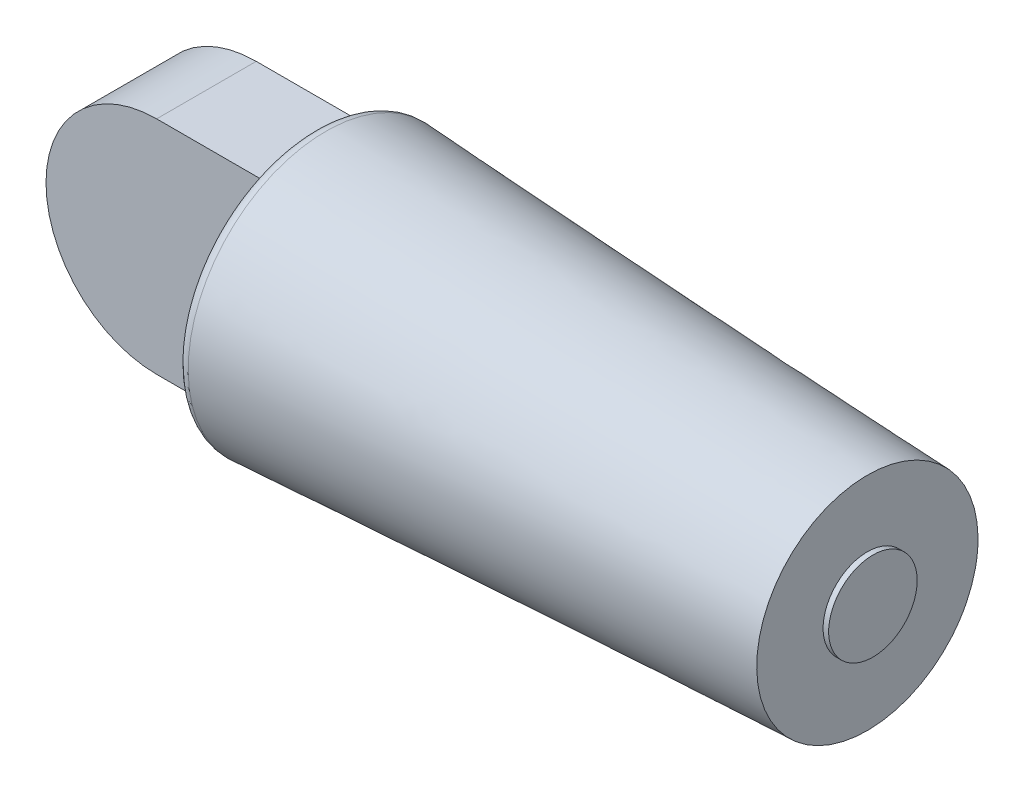
ISO-10303-21;
HEADER;
FILE_DESCRIPTION(('STEP AP214'),'2;1');
FILE_NAME('part.step','',(''),(''),'','','');
FILE_SCHEMA(('AUTOMOTIVE_DESIGN { 1 0 10303 214 1 1 1 1 }'));
ENDSEC;
DATA;
#1=APPLICATION_CONTEXT('core data for automotive mechanical design processes');
#2=APPLICATION_PROTOCOL_DEFINITION('international standard','automotive_design',2000,#1);
#3=PRODUCT_CONTEXT('',#1,'mechanical');
#4=PRODUCT('Part','Part','',(#3));
#5=PRODUCT_RELATED_PRODUCT_CATEGORY('part','',(#4));
#6=PRODUCT_DEFINITION_FORMATION('','',#4);
#7=PRODUCT_DEFINITION_CONTEXT('part definition',#1,'design');
#8=PRODUCT_DEFINITION('design','',#6,#7);
#9=PRODUCT_DEFINITION_SHAPE('','',#8);
#10=(LENGTH_UNIT() NAMED_UNIT(*) SI_UNIT(.MILLI.,.METRE.));
#11=(NAMED_UNIT(*) PLANE_ANGLE_UNIT() SI_UNIT($,.RADIAN.));
#12=(NAMED_UNIT(*) SI_UNIT($,.STERADIAN.) SOLID_ANGLE_UNIT());
#13=UNCERTAINTY_MEASURE_WITH_UNIT(LENGTH_MEASURE(1.E-05),#10,'distance_accuracy_value','');
#14=(GEOMETRIC_REPRESENTATION_CONTEXT(3) GLOBAL_UNCERTAINTY_ASSIGNED_CONTEXT((#13)) GLOBAL_UNIT_ASSIGNED_CONTEXT((#10,
#11,#12)) REPRESENTATION_CONTEXT('',''));
#15=CARTESIAN_POINT('',(0.,0.,0.));
#16=DIRECTION('',(0.,0.,1.));
#17=DIRECTION('',(1.,0.,0.));
#18=AXIS2_PLACEMENT_3D('',#15,#16,#17);
#19=CARTESIAN_POINT('',(10.,0.,0.));
#20=DIRECTION('',(1.,0.,0.));
#21=DIRECTION('',(0.,0.,-1.));
#22=AXIS2_PLACEMENT_3D('',#19,#20,#21);
#23=TOROIDAL_SURFACE('',#22,114.414427293307,10.);
#24=CARTESIAN_POINT('',(0.,0.,0.));
#25=DIRECTION('',(1.,0.,0.));
#26=DIRECTION('',(0.,0.,-1.));
#27=AXIS2_PLACEMENT_3D('',#24,#25,#26);
#28=CIRCLE('',#27,114.414427293307);
#29=CARTESIAN_POINT('',(0.,0.,-114.414427293307));
#30=VERTEX_POINT('',#29);
#31=EDGE_CURVE('E102',#30,#30,#28,.F.);
#32=ORIENTED_EDGE('',*,*,#31,.F.);
#33=EDGE_LOOP('',(#32));
#34=FACE_BOUND('',#33,.T.);
#35=CARTESIAN_POINT('',(10.5672782153275,0.,0.));
#36=DIRECTION('',(1.,0.,0.));
#37=DIRECTION('',(0.,0.,-1.));
#38=AXIS2_PLACEMENT_3D('',#35,#36,#37);
#39=CIRCLE('',#38,124.398324098984);
#40=CARTESIAN_POINT('',(10.5672782153275,10.081074166,123.989172843017));
#41=VERTEX_POINT('',#40);
#42=EDGE_CURVE('E44',#41,#41,#39,.T.);
#43=ORIENTED_EDGE('',*,*,#42,.F.);
#44=EDGE_LOOP('',(#43));
#45=FACE_BOUND('',#44,.T.);
#46=ADVANCED_FACE('F41',(#34,#45),#23,.T.);
#47=CARTESIAN_POINT('',(-200.,100.,-47.6787688835192));
#48=DIRECTION('',(0.,0.,1.));
#49=DIRECTION('',(0.,-1.,0.));
#50=AXIS2_PLACEMENT_3D('',#47,#48,#49);
#51=PLANE('',#50);
#52=DIRECTION('',(1.,0.,0.));
#53=VECTOR('',#52,1.);
#54=CARTESIAN_POINT('',(-200.,-100.,-47.6787688835192));
#55=LINE('',#54,#53);
#56=CARTESIAN_POINT('',(-100.,-100.,-47.6787688835192));
#57=VERTEX_POINT('',#56);
#58=CARTESIAN_POINT('',(0.,-100.,-47.6787688835192));
#59=VERTEX_POINT('',#58);
#60=EDGE_CURVE('E93',#57,#59,#55,.T.);
#61=ORIENTED_EDGE('',*,*,#60,.F.);
#62=CARTESIAN_POINT('',(-100.,0.,-47.6787688835192));
#63=DIRECTION('',(0.,0.,1.));
#64=DIRECTION('',(0.,-1.,0.));
#65=AXIS2_PLACEMENT_3D('',#62,#63,#64);
#66=CIRCLE('',#65,100.);
#67=CARTESIAN_POINT('',(-100.,100.,-47.6787688835192));
#68=VERTEX_POINT('',#67);
#69=EDGE_CURVE('E81',#68,#57,#66,.T.);
#70=ORIENTED_EDGE('',*,*,#69,.F.);
#71=DIRECTION('',(1.,0.,0.));
#72=VECTOR('',#71,1.);
#73=CARTESIAN_POINT('',(-200.,100.,-47.6787688835192));
#74=LINE('',#73,#72);
#75=CARTESIAN_POINT('',(0.,100.,-47.6787688835192));
#76=VERTEX_POINT('',#75);
#77=EDGE_CURVE('E64',#68,#76,#74,.T.);
#78=ORIENTED_EDGE('',*,*,#77,.T.);
#79=DIRECTION('',(0.,-1.,0.));
#80=VECTOR('',#79,1.);
#81=CARTESIAN_POINT('',(0.,100.,-47.6787688835192));
#82=LINE('',#81,#80);
#83=EDGE_CURVE('E98',#76,#59,#82,.T.);
#84=ORIENTED_EDGE('',*,*,#83,.T.);
#85=EDGE_LOOP('',(#61,#70,#78,#84));
#86=FACE_BOUND('',#85,.T.);
#87=ADVANCED_FACE('F97',(#86),#51,.F.);
#88=CARTESIAN_POINT('',(-200.,100.,42.3212311164808));
#89=DIRECTION('',(0.,0.,-1.));
#90=DIRECTION('',(0.,1.,0.));
#91=AXIS2_PLACEMENT_3D('',#88,#89,#90);
#92=PLANE('',#91);
#93=DIRECTION('',(1.,0.,0.));
#94=VECTOR('',#93,1.);
#95=CARTESIAN_POINT('',(-200.,100.,42.3212311164808));
#96=LINE('',#95,#94);
#97=CARTESIAN_POINT('',(-100.,100.,42.3212311164808));
#98=VERTEX_POINT('',#97);
#99=CARTESIAN_POINT('',(0.,100.,42.3212311164808));
#100=VERTEX_POINT('',#99);
#101=EDGE_CURVE('E104',#98,#100,#96,.T.);
#102=ORIENTED_EDGE('',*,*,#101,.F.);
#103=CARTESIAN_POINT('',(-100.,0.,42.3212311164808));
#104=DIRECTION('',(0.,0.,-1.));
#105=DIRECTION('',(0.,1.,0.));
#106=AXIS2_PLACEMENT_3D('',#103,#104,#105);
#107=CIRCLE('',#106,100.);
#108=CARTESIAN_POINT('',(-100.,-100.,42.3212311164808));
#109=VERTEX_POINT('',#108);
#110=EDGE_CURVE('E56',#98,#109,#107,.F.);
#111=ORIENTED_EDGE('',*,*,#110,.T.);
#112=DIRECTION('',(1.,0.,0.));
#113=VECTOR('',#112,1.);
#114=CARTESIAN_POINT('',(-200.,-100.,42.3212311164808));
#115=LINE('',#114,#113);
#116=CARTESIAN_POINT('',(0.,-100.,42.3212311164808));
#117=VERTEX_POINT('',#116);
#118=EDGE_CURVE('E95',#109,#117,#115,.T.);
#119=ORIENTED_EDGE('',*,*,#118,.T.);
#120=DIRECTION('',(0.,1.,0.));
#121=VECTOR('',#120,1.);
#122=CARTESIAN_POINT('',(0.,100.,42.3212311164808));
#123=LINE('',#122,#121);
#124=EDGE_CURVE('E192',#117,#100,#123,.T.);
#125=ORIENTED_EDGE('',*,*,#124,.T.);
#126=EDGE_LOOP('',(#102,#111,#119,#125));
#127=FACE_BOUND('',#126,.T.);
#128=ADVANCED_FACE('F159',(#127),#92,.F.);
#129=CARTESIAN_POINT('',(0.,0.,0.));
#130=DIRECTION('',(1.,0.,0.));
#131=DIRECTION('',(0.,0.,-1.));
#132=AXIS2_PLACEMENT_3D('',#129,#130,#131);
#133=PLANE('',#132);
#134=ORIENTED_EDGE('',*,*,#31,.T.);
#135=EDGE_LOOP('',(#134));
#136=FACE_BOUND('',#135,.T.);
#137=ORIENTED_EDGE('',*,*,#83,.F.);
#138=DIRECTION('',(0.,0.,-1.));
#139=VECTOR('',#138,1.);
#140=CARTESIAN_POINT('',(0.,100.,-47.6787688835192));
#141=LINE('',#140,#139);
#142=EDGE_CURVE('E195',#100,#76,#141,.T.);
#143=ORIENTED_EDGE('',*,*,#142,.F.);
#144=ORIENTED_EDGE('',*,*,#124,.F.);
#145=DIRECTION('',(0.,0.,1.));
#146=VECTOR('',#145,1.);
#147=CARTESIAN_POINT('',(0.,-100.,-47.6787688835192));
#148=LINE('',#147,#146);
#149=EDGE_CURVE('E190',#59,#117,#148,.T.);
#150=ORIENTED_EDGE('',*,*,#149,.F.);
#151=EDGE_LOOP('',(#137,#143,#144,#150));
#152=FACE_BOUND('',#151,.T.);
#153=ADVANCED_FACE('F129',(#136,#152),#133,.F.);
#154=CARTESIAN_POINT('',(500.,0.,0.));
#155=DIRECTION('',(1.,0.,0.));
#156=DIRECTION('',(0.,0.,-1.));
#157=AXIS2_PLACEMENT_3D('',#154,#155,#156);
#158=PLANE('',#157);
#159=CARTESIAN_POINT('',(500.,0.,0.));
#160=DIRECTION('',(1.,0.,0.));
#161=DIRECTION('',(0.,0.,-1.));
#162=AXIS2_PLACEMENT_3D('',#159,#160,#161);
#163=CIRCLE('',#162,40.);
#164=CARTESIAN_POINT('',(500.,0.,-40.));
#165=VERTEX_POINT('',#164);
#166=EDGE_CURVE('E12',#165,#165,#163,.T.);
#167=ORIENTED_EDGE('',*,*,#166,.F.);
#168=EDGE_LOOP('',(#167));
#169=FACE_BOUND('',#168,.T.);
#170=CARTESIAN_POINT('',(500.,0.,0.));
#171=DIRECTION('',(1.,0.,0.));
#172=DIRECTION('',(0.,0.,-1.));
#173=AXIS2_PLACEMENT_3D('',#170,#171,#172);
#174=CIRCLE('',#173,100.);
#175=CARTESIAN_POINT('',(500.,33.6372161619015,94.1729137750209));
#176=VERTEX_POINT('',#175);
#177=EDGE_CURVE('E99',#176,#176,#174,.T.);
#178=ORIENTED_EDGE('',*,*,#177,.T.);
#179=EDGE_LOOP('',(#178));
#180=FACE_BOUND('',#179,.T.);
#181=ADVANCED_FACE('F127',(#169,#180),#158,.T.);
#182=CARTESIAN_POINT('',(0.,9.57247656908665,124.632931813122));
#183=CARTESIAN_POINT('',(500.,33.6372161619015,94.1729137750209));
#184=CARTESIAN_POINT('',(0.,-239.693387057157,143.777884951295));
#185=CARTESIAN_POINT('',(500.,-154.70861138814,161.447346098824));
#186=CARTESIAN_POINT('',(0.,-258.83834019533,-105.487978674948));
#187=CARTESIAN_POINT('',(500.,-221.983043711943,-26.898481451218));
#188=CARTESIAN_POINT('',(0.,-9.57247656908678,-124.632931813122));
#189=CARTESIAN_POINT('',(500.,-33.6372161619014,-94.1729137750209));
#190=CARTESIAN_POINT('',(0.,239.693387057157,-143.777884951295));
#191=CARTESIAN_POINT('',(500.,154.70861138814,-161.447346098824));
#192=CARTESIAN_POINT('',(0.,258.83834019533,105.487978674948));
#193=CARTESIAN_POINT('',(500.,221.983043711943,26.8984814512181));
#194=CARTESIAN_POINT('',(0.,9.57247656908665,124.632931813122));
#195=CARTESIAN_POINT('',(500.,33.6372161619015,94.1729137750209));
#196=(BOUNDED_SURFACE() B_SPLINE_SURFACE(3,1,((#182,#183),(#184,#185),(#186,#187),(#188,#189),
(#190,#191),(#192,#193),(#194,#195)),.UNSPECIFIED.,.T.,.F.,.F.) B_SPLINE_SURFACE_WITH_KNOTS((4,
3,4),(2,2),(0.,0.5,1.),(0.,1.),
.UNSPECIFIED.) GEOMETRIC_REPRESENTATION_ITEM() RATIONAL_B_SPLINE_SURFACE(((1.,1.),
(0.333333333333334,0.333333333333333),(0.333333333333334,0.333333333333333),(1.,1.),
(0.333333333333333,0.333333333333333),(0.333333333333333,0.333333333333333),(1.,1.))) REPRESENTATION_ITEM('') SURFACE());
#197=CARTESIAN_POINT('',(10.5672782153275,10.081074166,123.989172843017));
#198=CARTESIAN_POINT('',(15.6655357339178,10.326450645124,123.678586811059));
#199=CARTESIAN_POINT('',(20.7637932525081,10.571827124248,123.3680007791));
#200=CARTESIAN_POINT('',(30.9603082896888,11.0625800824959,122.746828715184));
#201=CARTESIAN_POINT('',(36.0585658082792,11.3079565616199,122.436242683225));
#202=CARTESIAN_POINT('',(46.2550808454598,11.7987095198678,121.815070619309));
#203=CARTESIAN_POINT('',(51.3533383640502,12.0440859989918,121.504484587351));
#204=CARTESIAN_POINT('',(61.5498534012309,12.5348389572397,120.883312523434));
#205=CARTESIAN_POINT('',(66.6481109198212,12.7802154363637,120.572726491476));
#206=CARTESIAN_POINT('',(76.8446259570019,13.2709683946117,119.951554427559));
#207=CARTESIAN_POINT('',(81.9428834755922,13.5163448737356,119.640968395601));
#208=CARTESIAN_POINT('',(92.1393985127729,14.0070978319836,119.019796331684));
#209=CARTESIAN_POINT('',(97.2376560313632,14.2524743111076,118.709210299726));
#210=CARTESIAN_POINT('',(107.434171068544,14.7432272693555,118.088038235809));
#211=CARTESIAN_POINT('',(112.532428587134,14.9886037484795,117.777452203851));
#212=CARTESIAN_POINT('',(122.728943624315,15.4793567067274,117.156280139934));
#213=CARTESIAN_POINT('',(127.827201142905,15.7247331858514,116.845694107976));
#214=CARTESIAN_POINT('',(138.023716180086,16.2154861440993,116.22452204406));
#215=CARTESIAN_POINT('',(143.121973698676,16.4608626232233,115.913936012101));
#216=CARTESIAN_POINT('',(153.318488735857,16.9516155814713,115.292763948185));
#217=CARTESIAN_POINT('',(158.416746254447,17.1969920605952,114.982177916226));
#218=CARTESIAN_POINT('',(168.613261291628,17.6877450188432,114.36100585231));
#219=CARTESIAN_POINT('',(173.711518810218,17.9331214979672,114.050419820352));
#220=CARTESIAN_POINT('',(183.908033847399,18.4238744562151,113.429247756435));
#221=CARTESIAN_POINT('',(189.006291365989,18.6692509353391,113.118661724477));
#222=CARTESIAN_POINT('',(199.20280640317,19.160003893587,112.49748966056));
#223=CARTESIAN_POINT('',(204.30106392176,19.405380372711,112.186903628602));
#224=CARTESIAN_POINT('',(214.497578958941,19.8961333309589,111.565731564685));
#225=CARTESIAN_POINT('',(219.595836477531,20.1415098100829,111.255145532727));
#226=CARTESIAN_POINT('',(229.792351514712,20.6322627683309,110.63397346881));
#227=CARTESIAN_POINT('',(234.890609033302,20.8776392474548,110.323387436852));
#228=CARTESIAN_POINT('',(245.087124070483,21.3683922057028,109.702215372935));
#229=CARTESIAN_POINT('',(250.185381589073,21.6137686848268,109.391629340977));
#230=CARTESIAN_POINT('',(260.381896626254,22.1045216430747,108.770457277061));
#231=CARTESIAN_POINT('',(265.480154144844,22.3498981221987,108.459871245102));
#232=CARTESIAN_POINT('',(275.676669182025,22.8406510804466,107.838699181186));
#233=CARTESIAN_POINT('',(280.774926700615,23.0860275595706,107.528113149227));
#234=CARTESIAN_POINT('',(290.971441737796,23.5767805178186,106.906941085311));
#235=CARTESIAN_POINT('',(296.069699256386,23.8221569969425,106.596355053353));
#236=CARTESIAN_POINT('',(306.266214293567,24.3129099551905,105.975182989436));
#237=CARTESIAN_POINT('',(311.364471812157,24.5582864343144,105.664596957478));
#238=CARTESIAN_POINT('',(321.560986849338,25.0490393925624,105.043424893561));
#239=CARTESIAN_POINT('',(326.659244367928,25.2944158716864,104.732838861603));
#240=CARTESIAN_POINT('',(336.855759405109,25.7851688299343,104.111666797686));
#241=CARTESIAN_POINT('',(341.954016923699,26.0305453090583,103.801080765728));
#242=CARTESIAN_POINT('',(352.15053196088,26.5212982673062,103.179908701811));
#243=CARTESIAN_POINT('',(357.248789479471,26.7666747464302,102.869322669853));
#244=CARTESIAN_POINT('',(367.445304516651,27.2574277046781,102.248150605936));
#245=CARTESIAN_POINT('',(372.543562035242,27.5028041838021,101.937564573978));
#246=CARTESIAN_POINT('',(382.740077072422,27.9935571420501,101.316392510062));
#247=CARTESIAN_POINT('',(387.838334591013,28.238933621174,101.005806478103));
#248=CARTESIAN_POINT('',(398.034849628193,28.729686579422,100.384634414187));
#249=CARTESIAN_POINT('',(403.133107146784,28.975063058546,100.074048382228));
#250=CARTESIAN_POINT('',(413.329622183964,29.4658160167939,99.4528763183119));
#251=CARTESIAN_POINT('',(418.427879702555,29.7111924959179,99.1422902863536));
#252=CARTESIAN_POINT('',(428.624394739735,30.2019454541658,98.521118222437));
#253=CARTESIAN_POINT('',(433.722652258326,30.4473219332898,98.2105321904787));
#254=CARTESIAN_POINT('',(443.919167295506,30.9380748915377,97.5893601265621));
#255=CARTESIAN_POINT('',(449.017424814097,31.1834513706617,97.2787740946038));
#256=CARTESIAN_POINT('',(459.213939851277,31.6742043289097,96.6576020306872));
#257=CARTESIAN_POINT('',(464.312197369868,31.9195808080336,96.3470159987289));
#258=CARTESIAN_POINT('',(474.508712407048,32.4103337662816,95.7258439348124));
#259=CARTESIAN_POINT('',(479.606969925639,32.6557102454056,95.4152579028541));
#260=CARTESIAN_POINT('',(489.803484962819,33.1464632036535,94.7940858389375));
#261=CARTESIAN_POINT('',(494.90174248141,33.3918396827775,94.4834998069792));
#262=CARTESIAN_POINT('',(500.,33.6372161619015,94.1729137750209));
#263=B_SPLINE_CURVE_WITH_KNOTS('',3,(#197,#198,#199,#200,#201,#202,#203,#204,#205,#206,#207,
#208,#209,#210,#211,#212,#213,#214,#215,#216,#217,#218,#219,#220,#221,#222,#223,#224,#225,#226,
#227,#228,#229,#230,#231,#232,#233,#234,#235,#236,#237,#238,#239,#240,#241,#242,#243,#244,#245,
#246,#247,#248,#249,#250,#251,#252,#253,#254,#255,#256,#257,#258,#259,#260,#261,#262),
.UNSPECIFIED.,.F.,.F.,(4,2,2,2,2,2,2,2,2,2,2,2,2,2,2,2,2,2,2,2,2,2,2,2,2,2,2,2,2,2,2,2,4),(0.,
15.3407994325772,30.6815988651543,46.0223982977315,61.3631977303087,76.7039971628859,
92.0447965954631,107.38559602804,122.726395460617,138.067194893195,153.407994325772,
168.748793758349,184.089593190926,199.430392623503,214.77119205608,230.111991488658,
245.452790921235,260.793590353812,276.134389786389,291.475189218966,306.815988651544,
322.156788084121,337.497587516698,352.838386949275,368.179186381852,383.519985814429,
398.860785247007,414.201584679584,429.542384112161,444.883183544738,460.223982977315,
475.564782409892,490.90558184247),.UNSPECIFIED.);
#264=EDGE_CURVE('BSEAM116',#41,#176,#263,.T.);
#265=ORIENTED_EDGE('',*,*,#42,.T.);
#266=ORIENTED_EDGE('',*,*,#177,.F.);
#267=ORIENTED_EDGE('',*,*,#264,.T.);
#268=ORIENTED_EDGE('',*,*,#264,.F.);
#269=EDGE_LOOP('',(#265,#267,#266,#268));
#270=FACE_BOUND('',#269,.T.);
#271=ADVANCED_FACE('F116',(#270),#196,.T.);
#272=CARTESIAN_POINT('',(-200.,-100.,-47.6787688835192));
#273=DIRECTION('',(0.,1.,0.));
#274=DIRECTION('',(0.,0.,1.));
#275=AXIS2_PLACEMENT_3D('',#272,#273,#274);
#276=PLANE('',#275);
#277=ORIENTED_EDGE('',*,*,#118,.F.);
#278=DIRECTION('',(0.,0.,-1.));
#279=VECTOR('',#278,1.);
#280=CARTESIAN_POINT('',(-100.,-100.,152.321231116481));
#281=LINE('',#280,#279);
#282=EDGE_CURVE('E84',#109,#57,#281,.T.);
#283=ORIENTED_EDGE('',*,*,#282,.T.);
#284=ORIENTED_EDGE('',*,*,#60,.T.);
#285=ORIENTED_EDGE('',*,*,#149,.T.);
#286=EDGE_LOOP('',(#277,#283,#284,#285));
#287=FACE_BOUND('',#286,.T.);
#288=ADVANCED_FACE('F91',(#287),#276,.F.);
#289=CARTESIAN_POINT('',(-200.,100.,-47.6787688835192));
#290=DIRECTION('',(0.,-1.,0.));
#291=DIRECTION('',(0.,0.,-1.));
#292=AXIS2_PLACEMENT_3D('',#289,#290,#291);
#293=PLANE('',#292);
#294=ORIENTED_EDGE('',*,*,#77,.F.);
#295=DIRECTION('',(0.,0.,-1.));
#296=VECTOR('',#295,1.);
#297=CARTESIAN_POINT('',(-100.,100.,152.321231116481));
#298=LINE('',#297,#296);
#299=EDGE_CURVE('E86',#98,#68,#298,.T.);
#300=ORIENTED_EDGE('',*,*,#299,.F.);
#301=ORIENTED_EDGE('',*,*,#101,.T.);
#302=ORIENTED_EDGE('',*,*,#142,.T.);
#303=EDGE_LOOP('',(#294,#300,#301,#302));
#304=FACE_BOUND('',#303,.T.);
#305=ADVANCED_FACE('F167',(#304),#293,.F.);
#306=CARTESIAN_POINT('',(-100.,0.,152.321231116481));
#307=DIRECTION('',(0.,0.,-1.));
#308=DIRECTION('',(0.,1.,0.));
#309=AXIS2_PLACEMENT_3D('',#306,#307,#308);
#310=CYLINDRICAL_SURFACE('',#309,100.);
#311=ORIENTED_EDGE('',*,*,#299,.T.);
#312=ORIENTED_EDGE('',*,*,#69,.T.);
#313=ORIENTED_EDGE('',*,*,#282,.F.);
#314=ORIENTED_EDGE('',*,*,#110,.F.);
#315=EDGE_LOOP('',(#311,#312,#313,#314));
#316=FACE_BOUND('',#315,.T.);
#317=ADVANCED_FACE('F83',(#316),#310,.T.);
#318=CARTESIAN_POINT('',(505.,0.,0.));
#319=DIRECTION('',(-1.,0.,0.));
#320=DIRECTION('',(0.,0.,1.));
#321=AXIS2_PLACEMENT_3D('',#318,#319,#320);
#322=CYLINDRICAL_SURFACE('',#321,40.);
#323=CARTESIAN_POINT('',(505.,0.,0.));
#324=DIRECTION('',(1.,0.,0.));
#325=DIRECTION('',(0.,0.,-1.));
#326=AXIS2_PLACEMENT_3D('',#323,#324,#325);
#327=CIRCLE('',#326,40.);
#328=CARTESIAN_POINT('',(505.,0.,-40.));
#329=VERTEX_POINT('',#328);
#330=EDGE_CURVE('E88',#329,#329,#327,.T.);
#331=ORIENTED_EDGE('',*,*,#330,.F.);
#332=EDGE_LOOP('',(#331));
#333=FACE_BOUND('',#332,.T.);
#334=ORIENTED_EDGE('',*,*,#166,.T.);
#335=EDGE_LOOP('',(#334));
#336=FACE_BOUND('',#335,.T.);
#337=ADVANCED_FACE('F174',(#333,#336),#322,.T.);
#338=CARTESIAN_POINT('',(505.,0.,0.));
#339=DIRECTION('',(1.,0.,0.));
#340=DIRECTION('',(0.,0.,-1.));
#341=AXIS2_PLACEMENT_3D('',#338,#339,#340);
#342=PLANE('',#341);
#343=ORIENTED_EDGE('',*,*,#330,.T.);
#344=EDGE_LOOP('',(#343));
#345=FACE_BOUND('',#344,.T.);
#346=ADVANCED_FACE('F177',(#345),#342,.T.);
#347=CLOSED_SHELL('',(#46,#87,#128,#153,#181,#271,#288,#305,#317,#337,#346));
#348=MANIFOLD_SOLID_BREP('B2',#347);
#349=ADVANCED_BREP_SHAPE_REPRESENTATION('',(#18,#348),#14);
#350=SHAPE_DEFINITION_REPRESENTATION(#9,#349);
ENDSEC;
END-ISO-10303-21;
